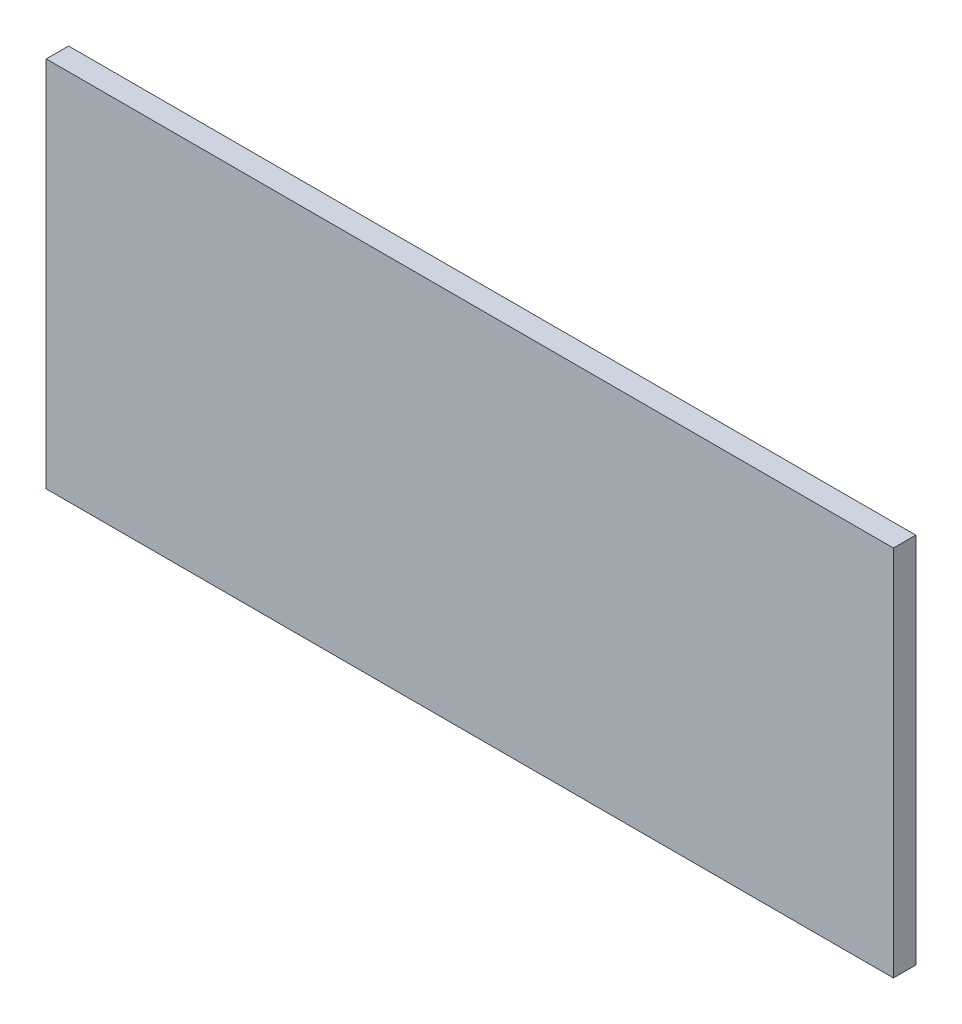
ISO-10303-21;
HEADER;
FILE_DESCRIPTION(('STEP AP214'),'2;1');
FILE_NAME('part.step','',(''),(''),'','','');
FILE_SCHEMA(('AUTOMOTIVE_DESIGN { 1 0 10303 214 1 1 1 1 }'));
ENDSEC;
DATA;
#1=APPLICATION_CONTEXT('core data for automotive mechanical design processes');
#2=APPLICATION_PROTOCOL_DEFINITION('international standard','automotive_design',2000,#1);
#3=PRODUCT_CONTEXT('',#1,'mechanical');
#4=PRODUCT('Part','Part','',(#3));
#5=PRODUCT_RELATED_PRODUCT_CATEGORY('part','',(#4));
#6=PRODUCT_DEFINITION_FORMATION('','',#4);
#7=PRODUCT_DEFINITION_CONTEXT('part definition',#1,'design');
#8=PRODUCT_DEFINITION('design','',#6,#7);
#9=PRODUCT_DEFINITION_SHAPE('','',#8);
#10=(LENGTH_UNIT() NAMED_UNIT(*) SI_UNIT(.MILLI.,.METRE.));
#11=(NAMED_UNIT(*) PLANE_ANGLE_UNIT() SI_UNIT($,.RADIAN.));
#12=(NAMED_UNIT(*) SI_UNIT($,.STERADIAN.) SOLID_ANGLE_UNIT());
#13=UNCERTAINTY_MEASURE_WITH_UNIT(LENGTH_MEASURE(1.E-05),#10,'distance_accuracy_value','');
#14=(GEOMETRIC_REPRESENTATION_CONTEXT(3) GLOBAL_UNCERTAINTY_ASSIGNED_CONTEXT((#13)) GLOBAL_UNIT_ASSIGNED_CONTEXT((#10,
#11,#12)) REPRESENTATION_CONTEXT('',''));
#15=CARTESIAN_POINT('',(0.,0.,0.));
#16=DIRECTION('',(0.,0.,1.));
#17=DIRECTION('',(1.,0.,0.));
#18=AXIS2_PLACEMENT_3D('',#15,#16,#17);
#19=CARTESIAN_POINT('',(0.,0.,12.));
#20=DIRECTION('',(1.,0.,0.));
#21=DIRECTION('',(0.,0.,-1.));
#22=AXIS2_PLACEMENT_3D('',#19,#20,#21);
#23=PLANE('',#22);
#24=DIRECTION('',(0.,-1.,0.));
#25=VECTOR('',#24,1.);
#26=CARTESIAN_POINT('',(0.,0.,0.));
#27=LINE('',#26,#25);
#28=CARTESIAN_POINT('',(0.,200.,0.));
#29=VERTEX_POINT('',#28);
#30=CARTESIAN_POINT('',(0.,0.,0.));
#31=VERTEX_POINT('',#30);
#32=EDGE_CURVE('E93',#29,#31,#27,.T.);
#33=ORIENTED_EDGE('',*,*,#32,.T.);
#34=DIRECTION('',(0.,0.,-1.));
#35=VECTOR('',#34,1.);
#36=CARTESIAN_POINT('',(0.,0.,12.));
#37=LINE('',#36,#35);
#38=CARTESIAN_POINT('',(0.,0.,12.));
#39=VERTEX_POINT('',#38);
#40=EDGE_CURVE('E11',#39,#31,#37,.T.);
#41=ORIENTED_EDGE('',*,*,#40,.F.);
#42=DIRECTION('',(0.,-1.,0.));
#43=VECTOR('',#42,1.);
#44=CARTESIAN_POINT('',(0.,0.,12.));
#45=LINE('',#44,#43);
#46=CARTESIAN_POINT('',(0.,200.,12.));
#47=VERTEX_POINT('',#46);
#48=EDGE_CURVE('E81',#47,#39,#45,.T.);
#49=ORIENTED_EDGE('',*,*,#48,.F.);
#50=DIRECTION('',(0.,0.,-1.));
#51=VECTOR('',#50,1.);
#52=CARTESIAN_POINT('',(0.,200.,12.));
#53=LINE('',#52,#51);
#54=EDGE_CURVE('E89',#47,#29,#53,.T.);
#55=ORIENTED_EDGE('',*,*,#54,.T.);
#56=EDGE_LOOP('',(#33,#41,#49,#55));
#57=FACE_BOUND('',#56,.T.);
#58=ADVANCED_FACE('F30',(#57),#23,.F.);
#59=CARTESIAN_POINT('',(0.,0.,12.));
#60=DIRECTION('',(0.,1.,0.));
#61=DIRECTION('',(0.,0.,1.));
#62=AXIS2_PLACEMENT_3D('',#59,#60,#61);
#63=PLANE('',#62);
#64=DIRECTION('',(1.,0.,0.));
#65=VECTOR('',#64,1.);
#66=CARTESIAN_POINT('',(0.,0.,0.));
#67=LINE('',#66,#65);
#68=CARTESIAN_POINT('',(455.,0.,0.));
#69=VERTEX_POINT('',#68);
#70=EDGE_CURVE('E85',#31,#69,#67,.T.);
#71=ORIENTED_EDGE('',*,*,#70,.T.);
#72=DIRECTION('',(0.,0.,-1.));
#73=VECTOR('',#72,1.);
#74=CARTESIAN_POINT('',(455.,0.,12.));
#75=LINE('',#74,#73);
#76=CARTESIAN_POINT('',(455.,0.,12.));
#77=VERTEX_POINT('',#76);
#78=EDGE_CURVE('E38',#77,#69,#75,.T.);
#79=ORIENTED_EDGE('',*,*,#78,.F.);
#80=DIRECTION('',(1.,0.,0.));
#81=VECTOR('',#80,1.);
#82=CARTESIAN_POINT('',(0.,0.,12.));
#83=LINE('',#82,#81);
#84=EDGE_CURVE('E76',#39,#77,#83,.T.);
#85=ORIENTED_EDGE('',*,*,#84,.F.);
#86=ORIENTED_EDGE('',*,*,#40,.T.);
#87=EDGE_LOOP('',(#71,#79,#85,#86));
#88=FACE_BOUND('',#87,.T.);
#89=ADVANCED_FACE('F84',(#88),#63,.F.);
#90=CARTESIAN_POINT('',(455.,0.,12.));
#91=DIRECTION('',(-1.,0.,0.));
#92=DIRECTION('',(0.,0.,1.));
#93=AXIS2_PLACEMENT_3D('',#90,#91,#92);
#94=PLANE('',#93);
#95=DIRECTION('',(0.,1.,0.));
#96=VECTOR('',#95,1.);
#97=CARTESIAN_POINT('',(455.,0.,0.));
#98=LINE('',#97,#96);
#99=CARTESIAN_POINT('',(455.,200.,0.));
#100=VERTEX_POINT('',#99);
#101=EDGE_CURVE('E63',#69,#100,#98,.T.);
#102=ORIENTED_EDGE('',*,*,#101,.T.);
#103=DIRECTION('',(0.,0.,-1.));
#104=VECTOR('',#103,1.);
#105=CARTESIAN_POINT('',(455.,200.,12.));
#106=LINE('',#105,#104);
#107=CARTESIAN_POINT('',(455.,200.,12.));
#108=VERTEX_POINT('',#107);
#109=EDGE_CURVE('E86',#108,#100,#106,.T.);
#110=ORIENTED_EDGE('',*,*,#109,.F.);
#111=DIRECTION('',(0.,1.,0.));
#112=VECTOR('',#111,1.);
#113=CARTESIAN_POINT('',(455.,0.,12.));
#114=LINE('',#113,#112);
#115=EDGE_CURVE('E79',#77,#108,#114,.T.);
#116=ORIENTED_EDGE('',*,*,#115,.F.);
#117=ORIENTED_EDGE('',*,*,#78,.T.);
#118=EDGE_LOOP('',(#102,#110,#116,#117));
#119=FACE_BOUND('',#118,.T.);
#120=ADVANCED_FACE('F87',(#119),#94,.F.);
#121=CARTESIAN_POINT('',(0.,200.,12.));
#122=DIRECTION('',(0.,-1.,0.));
#123=DIRECTION('',(0.,0.,-1.));
#124=AXIS2_PLACEMENT_3D('',#121,#122,#123);
#125=PLANE('',#124);
#126=DIRECTION('',(-1.,0.,0.));
#127=VECTOR('',#126,1.);
#128=CARTESIAN_POINT('',(0.,200.,0.));
#129=LINE('',#128,#127);
#130=EDGE_CURVE('E69',#100,#29,#129,.T.);
#131=ORIENTED_EDGE('',*,*,#130,.T.);
#132=ORIENTED_EDGE('',*,*,#54,.F.);
#133=DIRECTION('',(-1.,0.,0.));
#134=VECTOR('',#133,1.);
#135=CARTESIAN_POINT('',(0.,200.,12.));
#136=LINE('',#135,#134);
#137=EDGE_CURVE('E46',#108,#47,#136,.T.);
#138=ORIENTED_EDGE('',*,*,#137,.F.);
#139=ORIENTED_EDGE('',*,*,#109,.T.);
#140=EDGE_LOOP('',(#131,#132,#138,#139));
#141=FACE_BOUND('',#140,.T.);
#142=ADVANCED_FACE('F100',(#141),#125,.F.);
#143=CARTESIAN_POINT('',(0.,200.,12.));
#144=DIRECTION('',(0.,0.,-1.));
#145=DIRECTION('',(-1.,0.,0.));
#146=AXIS2_PLACEMENT_3D('',#143,#144,#145);
#147=PLANE('',#146);
#148=ORIENTED_EDGE('',*,*,#48,.T.);
#149=ORIENTED_EDGE('',*,*,#84,.T.);
#150=ORIENTED_EDGE('',*,*,#115,.T.);
#151=ORIENTED_EDGE('',*,*,#137,.T.);
#152=EDGE_LOOP('',(#148,#149,#150,#151));
#153=FACE_BOUND('',#152,.T.);
#154=ADVANCED_FACE('F77',(#153),#147,.F.);
#155=CARTESIAN_POINT('',(0.,200.,0.));
#156=DIRECTION('',(0.,0.,-1.));
#157=DIRECTION('',(-1.,0.,0.));
#158=AXIS2_PLACEMENT_3D('',#155,#156,#157);
#159=PLANE('',#158);
#160=ORIENTED_EDGE('',*,*,#32,.F.);
#161=ORIENTED_EDGE('',*,*,#130,.F.);
#162=ORIENTED_EDGE('',*,*,#101,.F.);
#163=ORIENTED_EDGE('',*,*,#70,.F.);
#164=EDGE_LOOP('',(#160,#161,#162,#163));
#165=FACE_BOUND('',#164,.T.);
#166=ADVANCED_FACE('F103',(#165),#159,.T.);
#167=CLOSED_SHELL('',(#58,#89,#120,#142,#154,#166));
#168=MANIFOLD_SOLID_BREP('B2',#167);
#169=ADVANCED_BREP_SHAPE_REPRESENTATION('',(#18,#168),#14);
#170=SHAPE_DEFINITION_REPRESENTATION(#9,#169);
ENDSEC;
END-ISO-10303-21;
